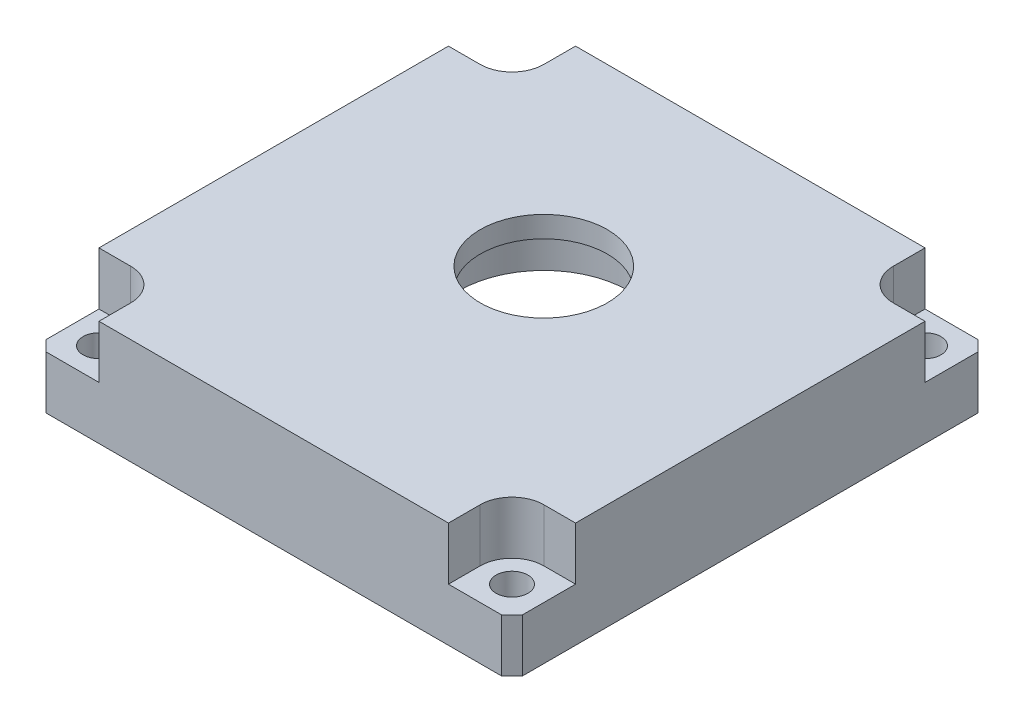
ISO-10303-21;
HEADER;
FILE_DESCRIPTION(('STEP AP214'),'2;1');
FILE_NAME('part.step','',(''),(''),'','','');
FILE_SCHEMA(('AUTOMOTIVE_DESIGN { 1 0 10303 214 1 1 1 1 }'));
ENDSEC;
DATA;
#1=APPLICATION_CONTEXT('core data for automotive mechanical design processes');
#2=APPLICATION_PROTOCOL_DEFINITION('international standard','automotive_design',2000,#1);
#3=PRODUCT_CONTEXT('',#1,'mechanical');
#4=PRODUCT('Part','Part','',(#3));
#5=PRODUCT_RELATED_PRODUCT_CATEGORY('part','',(#4));
#6=PRODUCT_DEFINITION_FORMATION('','',#4);
#7=PRODUCT_DEFINITION_CONTEXT('part definition',#1,'design');
#8=PRODUCT_DEFINITION('design','',#6,#7);
#9=PRODUCT_DEFINITION_SHAPE('','',#8);
#10=(LENGTH_UNIT() NAMED_UNIT(*) SI_UNIT(.MILLI.,.METRE.));
#11=(NAMED_UNIT(*) PLANE_ANGLE_UNIT() SI_UNIT($,.RADIAN.));
#12=(NAMED_UNIT(*) SI_UNIT($,.STERADIAN.) SOLID_ANGLE_UNIT());
#13=UNCERTAINTY_MEASURE_WITH_UNIT(LENGTH_MEASURE(1.E-05),#10,'distance_accuracy_value','');
#14=(GEOMETRIC_REPRESENTATION_CONTEXT(3) GLOBAL_UNCERTAINTY_ASSIGNED_CONTEXT((#13)) GLOBAL_UNIT_ASSIGNED_CONTEXT((#10,
#11,#12)) REPRESENTATION_CONTEXT('',''));
#15=CARTESIAN_POINT('',(0.,0.,0.));
#16=DIRECTION('',(0.,0.,1.));
#17=DIRECTION('',(1.,0.,0.));
#18=AXIS2_PLACEMENT_3D('',#15,#16,#17);
#19=CARTESIAN_POINT('',(19.5,0.,-19.5));
#20=DIRECTION('',(0.,1.,0.));
#21=DIRECTION('',(0.,0.,1.));
#22=AXIS2_PLACEMENT_3D('',#19,#20,#21);
#23=CYLINDRICAL_SURFACE('',#22,1.5);
#24=CARTESIAN_POINT('',(19.5,0.,-19.5));
#25=DIRECTION('',(0.,1.,0.));
#26=DIRECTION('',(0.,0.,-1.));
#27=AXIS2_PLACEMENT_3D('',#24,#25,#26);
#28=CIRCLE('',#27,1.5);
#29=CARTESIAN_POINT('',(19.5,0.,-21.));
#30=VERTEX_POINT('',#29);
#31=EDGE_CURVE('E388',#30,#30,#28,.T.);
#32=ORIENTED_EDGE('',*,*,#31,.F.);
#33=EDGE_LOOP('',(#32));
#34=FACE_BOUND('',#33,.T.);
#35=CARTESIAN_POINT('',(19.5,5.,-19.5));
#36=DIRECTION('',(0.,1.,0.));
#37=DIRECTION('',(0.,0.,1.));
#38=AXIS2_PLACEMENT_3D('',#35,#36,#37);
#39=CIRCLE('',#38,1.5);
#40=CARTESIAN_POINT('',(19.5,5.,-18.));
#41=VERTEX_POINT('',#40);
#42=EDGE_CURVE('E457',#41,#41,#39,.F.);
#43=ORIENTED_EDGE('',*,*,#42,.F.);
#44=EDGE_LOOP('',(#43));
#45=FACE_BOUND('',#44,.T.);
#46=ADVANCED_FACE('F38',(#34,#45),#23,.F.);
#47=CARTESIAN_POINT('',(-19.5,0.,19.5));
#48=DIRECTION('',(0.,1.,0.));
#49=DIRECTION('',(0.,0.,1.));
#50=AXIS2_PLACEMENT_3D('',#47,#48,#49);
#51=CYLINDRICAL_SURFACE('',#50,1.5);
#52=CARTESIAN_POINT('',(-19.5,0.,19.5));
#53=DIRECTION('',(0.,1.,0.));
#54=DIRECTION('',(0.,0.,-1.));
#55=AXIS2_PLACEMENT_3D('',#52,#53,#54);
#56=CIRCLE('',#55,1.5);
#57=CARTESIAN_POINT('',(-19.5,0.,18.));
#58=VERTEX_POINT('',#57);
#59=EDGE_CURVE('E397',#58,#58,#56,.T.);
#60=ORIENTED_EDGE('',*,*,#59,.F.);
#61=EDGE_LOOP('',(#60));
#62=FACE_BOUND('',#61,.T.);
#63=CARTESIAN_POINT('',(-19.5,5.,19.5));
#64=DIRECTION('',(0.,1.,0.));
#65=DIRECTION('',(0.,0.,1.));
#66=AXIS2_PLACEMENT_3D('',#63,#64,#65);
#67=CIRCLE('',#66,1.5);
#68=CARTESIAN_POINT('',(-19.5,5.,21.));
#69=VERTEX_POINT('',#68);
#70=EDGE_CURVE('E377',#69,#69,#67,.F.);
#71=ORIENTED_EDGE('',*,*,#70,.F.);
#72=EDGE_LOOP('',(#71));
#73=FACE_BOUND('',#72,.T.);
#74=ADVANCED_FACE('F596',(#62,#73),#51,.F.);
#75=CARTESIAN_POINT('',(22.5,10.,22.5));
#76=DIRECTION('',(-1.,0.,0.));
#77=DIRECTION('',(0.,0.,1.));
#78=AXIS2_PLACEMENT_3D('',#75,#76,#77);
#79=PLANE('',#78);
#80=DIRECTION('',(0.,0.,-1.));
#81=VECTOR('',#80,1.);
#82=CARTESIAN_POINT('',(22.5,5.,16.5));
#83=LINE('',#82,#81);
#84=CARTESIAN_POINT('',(22.5,5.,21.5));
#85=VERTEX_POINT('',#84);
#86=CARTESIAN_POINT('',(22.5,5.,16.5));
#87=VERTEX_POINT('',#86);
#88=EDGE_CURVE('E273',#85,#87,#83,.T.);
#89=ORIENTED_EDGE('',*,*,#88,.F.);
#90=DIRECTION('',(0.,-1.,0.));
#91=VECTOR('',#90,1.);
#92=CARTESIAN_POINT('',(22.5,10.,21.5));
#93=LINE('',#92,#91);
#94=CARTESIAN_POINT('',(22.5,0.,21.5));
#95=VERTEX_POINT('',#94);
#96=EDGE_CURVE('E466',#85,#95,#93,.T.);
#97=ORIENTED_EDGE('',*,*,#96,.T.);
#98=DIRECTION('',(0.,0.,-1.));
#99=VECTOR('',#98,1.);
#100=CARTESIAN_POINT('',(22.5,0.,22.5));
#101=LINE('',#100,#99);
#102=CARTESIAN_POINT('',(22.5,0.,-21.5));
#103=VERTEX_POINT('',#102);
#104=EDGE_CURVE('E418',#95,#103,#101,.T.);
#105=ORIENTED_EDGE('',*,*,#104,.T.);
#106=DIRECTION('',(0.,1.,0.));
#107=VECTOR('',#106,1.);
#108=CARTESIAN_POINT('',(22.5,10.,-21.5));
#109=LINE('',#108,#107);
#110=CARTESIAN_POINT('',(22.5,5.,-21.5));
#111=VERTEX_POINT('',#110);
#112=EDGE_CURVE('E228',#103,#111,#109,.T.);
#113=ORIENTED_EDGE('',*,*,#112,.T.);
#114=DIRECTION('',(0.,0.,-1.));
#115=VECTOR('',#114,1.);
#116=CARTESIAN_POINT('',(22.5,5.,-16.5));
#117=LINE('',#116,#115);
#118=CARTESIAN_POINT('',(22.5,5.,-16.5));
#119=VERTEX_POINT('',#118);
#120=EDGE_CURVE('E218',#119,#111,#117,.T.);
#121=ORIENTED_EDGE('',*,*,#120,.F.);
#122=DIRECTION('',(0.,1.,0.));
#123=VECTOR('',#122,1.);
#124=CARTESIAN_POINT('',(22.5,5.,-16.5));
#125=LINE('',#124,#123);
#126=CARTESIAN_POINT('',(22.5,10.,-16.5));
#127=VERTEX_POINT('',#126);
#128=EDGE_CURVE('E201',#119,#127,#125,.T.);
#129=ORIENTED_EDGE('',*,*,#128,.T.);
#130=DIRECTION('',(0.,0.,-1.));
#131=VECTOR('',#130,1.);
#132=CARTESIAN_POINT('',(22.5,10.,22.5));
#133=LINE('',#132,#131);
#134=CARTESIAN_POINT('',(22.5,10.,16.5));
#135=VERTEX_POINT('',#134);
#136=EDGE_CURVE('E422',#135,#127,#133,.T.);
#137=ORIENTED_EDGE('',*,*,#136,.F.);
#138=DIRECTION('',(0.,1.,0.));
#139=VECTOR('',#138,1.);
#140=CARTESIAN_POINT('',(22.5,5.,16.5));
#141=LINE('',#140,#139);
#142=EDGE_CURVE('E293',#87,#135,#141,.T.);
#143=ORIENTED_EDGE('',*,*,#142,.F.);
#144=EDGE_LOOP('',(#89,#97,#105,#113,#121,#129,#137,#143));
#145=FACE_BOUND('',#144,.T.);
#146=ADVANCED_FACE('F225',(#145),#79,.F.);
#147=CARTESIAN_POINT('',(-22.5,10.,-22.5));
#148=DIRECTION('',(0.,0.,1.));
#149=DIRECTION('',(1.,0.,0.));
#150=AXIS2_PLACEMENT_3D('',#147,#148,#149);
#151=PLANE('',#150);
#152=DIRECTION('',(-1.,0.,0.));
#153=VECTOR('',#152,1.);
#154=CARTESIAN_POINT('',(22.5,5.,-22.5));
#155=LINE('',#154,#153);
#156=CARTESIAN_POINT('',(21.5,5.,-22.5));
#157=VERTEX_POINT('',#156);
#158=CARTESIAN_POINT('',(16.5,5.,-22.5));
#159=VERTEX_POINT('',#158);
#160=EDGE_CURVE('E230',#157,#159,#155,.T.);
#161=ORIENTED_EDGE('',*,*,#160,.F.);
#162=DIRECTION('',(0.,-1.,0.));
#163=VECTOR('',#162,1.);
#164=CARTESIAN_POINT('',(21.5,10.,-22.5));
#165=LINE('',#164,#163);
#166=CARTESIAN_POINT('',(21.5,0.,-22.5));
#167=VERTEX_POINT('',#166);
#168=EDGE_CURVE('E504',#157,#167,#165,.T.);
#169=ORIENTED_EDGE('',*,*,#168,.T.);
#170=DIRECTION('',(-1.,0.,0.));
#171=VECTOR('',#170,1.);
#172=CARTESIAN_POINT('',(-22.5,0.,-22.5));
#173=LINE('',#172,#171);
#174=CARTESIAN_POINT('',(-21.5,0.,-22.5));
#175=VERTEX_POINT('',#174);
#176=EDGE_CURVE('E440',#167,#175,#173,.T.);
#177=ORIENTED_EDGE('',*,*,#176,.T.);
#178=DIRECTION('',(0.,1.,0.));
#179=VECTOR('',#178,1.);
#180=CARTESIAN_POINT('',(-21.5,10.,-22.5));
#181=LINE('',#180,#179);
#182=CARTESIAN_POINT('',(-21.5,5.,-22.5));
#183=VERTEX_POINT('',#182);
#184=EDGE_CURVE('E54',#175,#183,#181,.T.);
#185=ORIENTED_EDGE('',*,*,#184,.T.);
#186=DIRECTION('',(-1.,0.,0.));
#187=VECTOR('',#186,1.);
#188=CARTESIAN_POINT('',(-22.5,5.,-22.5));
#189=LINE('',#188,#187);
#190=CARTESIAN_POINT('',(-16.5,5.,-22.5));
#191=VERTEX_POINT('',#190);
#192=EDGE_CURVE('E355',#191,#183,#189,.T.);
#193=ORIENTED_EDGE('',*,*,#192,.F.);
#194=DIRECTION('',(0.,1.,0.));
#195=VECTOR('',#194,1.);
#196=CARTESIAN_POINT('',(-16.5,5.,-22.5));
#197=LINE('',#196,#195);
#198=CARTESIAN_POINT('',(-16.5,10.,-22.5));
#199=VERTEX_POINT('',#198);
#200=EDGE_CURVE('E381',#191,#199,#197,.T.);
#201=ORIENTED_EDGE('',*,*,#200,.T.);
#202=DIRECTION('',(-1.,0.,0.));
#203=VECTOR('',#202,1.);
#204=CARTESIAN_POINT('',(-22.5,10.,-22.5));
#205=LINE('',#204,#203);
#206=CARTESIAN_POINT('',(16.5,10.,-22.5));
#207=VERTEX_POINT('',#206);
#208=EDGE_CURVE('E425',#207,#199,#205,.T.);
#209=ORIENTED_EDGE('',*,*,#208,.F.);
#210=DIRECTION('',(0.,1.,0.));
#211=VECTOR('',#210,1.);
#212=CARTESIAN_POINT('',(16.5,5.,-22.5));
#213=LINE('',#212,#211);
#214=EDGE_CURVE('E213',#159,#207,#213,.T.);
#215=ORIENTED_EDGE('',*,*,#214,.F.);
#216=EDGE_LOOP('',(#161,#169,#177,#185,#193,#201,#209,#215));
#217=FACE_BOUND('',#216,.T.);
#218=ADVANCED_FACE('F510',(#217),#151,.F.);
#219=CARTESIAN_POINT('',(-22.5,10.,22.5));
#220=DIRECTION('',(1.,0.,0.));
#221=DIRECTION('',(0.,0.,-1.));
#222=AXIS2_PLACEMENT_3D('',#219,#220,#221);
#223=PLANE('',#222);
#224=DIRECTION('',(0.,0.,1.));
#225=VECTOR('',#224,1.);
#226=CARTESIAN_POINT('',(-22.5,0.,22.5));
#227=LINE('',#226,#225);
#228=CARTESIAN_POINT('',(-22.5,0.,-21.5));
#229=VERTEX_POINT('',#228);
#230=CARTESIAN_POINT('',(-22.5,0.,21.5));
#231=VERTEX_POINT('',#230);
#232=EDGE_CURVE('E443',#229,#231,#227,.T.);
#233=ORIENTED_EDGE('',*,*,#232,.T.);
#234=DIRECTION('',(0.,1.,0.));
#235=VECTOR('',#234,1.);
#236=CARTESIAN_POINT('',(-22.5,10.,21.5));
#237=LINE('',#236,#235);
#238=CARTESIAN_POINT('',(-22.5,5.,21.5));
#239=VERTEX_POINT('',#238);
#240=EDGE_CURVE('E496',#231,#239,#237,.T.);
#241=ORIENTED_EDGE('',*,*,#240,.T.);
#242=DIRECTION('',(0.,0.,1.));
#243=VECTOR('',#242,1.);
#244=CARTESIAN_POINT('',(-22.5,5.,16.5));
#245=LINE('',#244,#243);
#246=CARTESIAN_POINT('',(-22.5,5.,16.5));
#247=VERTEX_POINT('',#246);
#248=EDGE_CURVE('E307',#247,#239,#245,.T.);
#249=ORIENTED_EDGE('',*,*,#248,.F.);
#250=DIRECTION('',(0.,1.,0.));
#251=VECTOR('',#250,1.);
#252=CARTESIAN_POINT('',(-22.5,5.,16.5));
#253=LINE('',#252,#251);
#254=CARTESIAN_POINT('',(-22.5,10.,16.5));
#255=VERTEX_POINT('',#254);
#256=EDGE_CURVE('E323',#247,#255,#253,.T.);
#257=ORIENTED_EDGE('',*,*,#256,.T.);
#258=DIRECTION('',(0.,0.,1.));
#259=VECTOR('',#258,1.);
#260=CARTESIAN_POINT('',(-22.5,10.,22.5));
#261=LINE('',#260,#259);
#262=CARTESIAN_POINT('',(-22.5,10.,-16.5));
#263=VERTEX_POINT('',#262);
#264=EDGE_CURVE('E430',#263,#255,#261,.T.);
#265=ORIENTED_EDGE('',*,*,#264,.F.);
#266=DIRECTION('',(0.,1.,0.));
#267=VECTOR('',#266,1.);
#268=CARTESIAN_POINT('',(-22.5,5.,-16.5));
#269=LINE('',#268,#267);
#270=CARTESIAN_POINT('',(-22.5,5.,-16.5));
#271=VERTEX_POINT('',#270);
#272=EDGE_CURVE('E378',#271,#263,#269,.T.);
#273=ORIENTED_EDGE('',*,*,#272,.F.);
#274=DIRECTION('',(0.,0.,1.));
#275=VECTOR('',#274,1.);
#276=CARTESIAN_POINT('',(-22.5,5.,-16.5));
#277=LINE('',#276,#275);
#278=CARTESIAN_POINT('',(-22.5,5.,-21.5));
#279=VERTEX_POINT('',#278);
#280=EDGE_CURVE('E358',#279,#271,#277,.T.);
#281=ORIENTED_EDGE('',*,*,#280,.F.);
#282=DIRECTION('',(0.,-1.,0.));
#283=VECTOR('',#282,1.);
#284=CARTESIAN_POINT('',(-22.5,10.,-21.5));
#285=LINE('',#284,#283);
#286=EDGE_CURVE('E492',#279,#229,#285,.T.);
#287=ORIENTED_EDGE('',*,*,#286,.T.);
#288=EDGE_LOOP('',(#233,#241,#249,#257,#265,#273,#281,#287));
#289=FACE_BOUND('',#288,.T.);
#290=ADVANCED_FACE('F522',(#289),#223,.F.);
#291=CARTESIAN_POINT('',(-22.5,10.,22.5));
#292=DIRECTION('',(0.,0.,-1.));
#293=DIRECTION('',(-1.,0.,0.));
#294=AXIS2_PLACEMENT_3D('',#291,#292,#293);
#295=PLANE('',#294);
#296=DIRECTION('',(1.,0.,0.));
#297=VECTOR('',#296,1.);
#298=CARTESIAN_POINT('',(-22.5,0.,22.5));
#299=LINE('',#298,#297);
#300=CARTESIAN_POINT('',(-21.5,0.,22.5));
#301=VERTEX_POINT('',#300);
#302=CARTESIAN_POINT('',(21.5,0.,22.5));
#303=VERTEX_POINT('',#302);
#304=EDGE_CURVE('E426',#301,#303,#299,.T.);
#305=ORIENTED_EDGE('',*,*,#304,.T.);
#306=DIRECTION('',(0.,1.,0.));
#307=VECTOR('',#306,1.);
#308=CARTESIAN_POINT('',(21.5,10.,22.5));
#309=LINE('',#308,#307);
#310=CARTESIAN_POINT('',(21.5,5.,22.5));
#311=VERTEX_POINT('',#310);
#312=EDGE_CURVE('E486',#303,#311,#309,.T.);
#313=ORIENTED_EDGE('',*,*,#312,.T.);
#314=DIRECTION('',(1.,0.,0.));
#315=VECTOR('',#314,1.);
#316=CARTESIAN_POINT('',(22.5,5.,22.5));
#317=LINE('',#316,#315);
#318=CARTESIAN_POINT('',(16.5,5.,22.5));
#319=VERTEX_POINT('',#318);
#320=EDGE_CURVE('E269',#319,#311,#317,.T.);
#321=ORIENTED_EDGE('',*,*,#320,.F.);
#322=DIRECTION('',(0.,1.,0.));
#323=VECTOR('',#322,1.);
#324=CARTESIAN_POINT('',(16.5,5.,22.5));
#325=LINE('',#324,#323);
#326=CARTESIAN_POINT('',(16.5,10.,22.5));
#327=VERTEX_POINT('',#326);
#328=EDGE_CURVE('E296',#319,#327,#325,.T.);
#329=ORIENTED_EDGE('',*,*,#328,.T.);
#330=DIRECTION('',(1.,0.,0.));
#331=VECTOR('',#330,1.);
#332=CARTESIAN_POINT('',(-22.5,10.,22.5));
#333=LINE('',#332,#331);
#334=CARTESIAN_POINT('',(-16.5,10.,22.5));
#335=VERTEX_POINT('',#334);
#336=EDGE_CURVE('E434',#335,#327,#333,.T.);
#337=ORIENTED_EDGE('',*,*,#336,.F.);
#338=DIRECTION('',(0.,1.,0.));
#339=VECTOR('',#338,1.);
#340=CARTESIAN_POINT('',(-16.5,5.,22.5));
#341=LINE('',#340,#339);
#342=CARTESIAN_POINT('',(-16.5,5.,22.5));
#343=VERTEX_POINT('',#342);
#344=EDGE_CURVE('E340',#343,#335,#341,.T.);
#345=ORIENTED_EDGE('',*,*,#344,.F.);
#346=DIRECTION('',(1.,0.,0.));
#347=VECTOR('',#346,1.);
#348=CARTESIAN_POINT('',(-22.5,5.,22.5));
#349=LINE('',#348,#347);
#350=CARTESIAN_POINT('',(-21.5,5.,22.5));
#351=VERTEX_POINT('',#350);
#352=EDGE_CURVE('E312',#351,#343,#349,.T.);
#353=ORIENTED_EDGE('',*,*,#352,.F.);
#354=DIRECTION('',(0.,-1.,0.));
#355=VECTOR('',#354,1.);
#356=CARTESIAN_POINT('',(-21.5,10.,22.5));
#357=LINE('',#356,#355);
#358=EDGE_CURVE('E482',#351,#301,#357,.T.);
#359=ORIENTED_EDGE('',*,*,#358,.T.);
#360=EDGE_LOOP('',(#305,#313,#321,#329,#337,#345,#353,#359));
#361=FACE_BOUND('',#360,.T.);
#362=ADVANCED_FACE('F568',(#361),#295,.F.);
#363=CARTESIAN_POINT('',(0.,10.,0.));
#364=DIRECTION('',(0.,-1.,0.));
#365=DIRECTION('',(0.,0.,-1.));
#366=AXIS2_PLACEMENT_3D('',#363,#364,#365);
#367=PLANE('',#366);
#368=CARTESIAN_POINT('',(0.,10.,-3.));
#369=DIRECTION('',(0.,-1.,0.));
#370=DIRECTION('',(0.,0.,-1.));
#371=AXIS2_PLACEMENT_3D('',#368,#369,#370);
#372=CIRCLE('',#371,6.);
#373=CARTESIAN_POINT('',(0.,10.,-9.));
#374=VERTEX_POINT('',#373);
#375=EDGE_CURVE('E328',#374,#374,#372,.T.);
#376=ORIENTED_EDGE('',*,*,#375,.T.);
#377=EDGE_LOOP('',(#376));
#378=FACE_BOUND('',#377,.T.);
#379=ORIENTED_EDGE('',*,*,#264,.T.);
#380=DIRECTION('',(-1.,0.,0.));
#381=VECTOR('',#380,1.);
#382=CARTESIAN_POINT('',(-19.5,10.,16.5));
#383=LINE('',#382,#381);
#384=CARTESIAN_POINT('',(-19.5,10.,16.5));
#385=VERTEX_POINT('',#384);
#386=EDGE_CURVE('E324',#385,#255,#383,.T.);
#387=ORIENTED_EDGE('',*,*,#386,.F.);
#388=CARTESIAN_POINT('',(-19.5,10.,19.5));
#389=DIRECTION('',(0.,1.,0.));
#390=DIRECTION('',(0.,0.,1.));
#391=AXIS2_PLACEMENT_3D('',#388,#389,#390);
#392=CIRCLE('',#391,3.);
#393=CARTESIAN_POINT('',(-16.5,10.,19.5));
#394=VERTEX_POINT('',#393);
#395=EDGE_CURVE('E308',#394,#385,#392,.T.);
#396=ORIENTED_EDGE('',*,*,#395,.F.);
#397=DIRECTION('',(0.,0.,-1.));
#398=VECTOR('',#397,1.);
#399=CARTESIAN_POINT('',(-16.5,10.,22.5));
#400=LINE('',#399,#398);
#401=EDGE_CURVE('E327',#335,#394,#400,.T.);
#402=ORIENTED_EDGE('',*,*,#401,.F.);
#403=ORIENTED_EDGE('',*,*,#336,.T.);
#404=DIRECTION('',(0.,0.,1.));
#405=VECTOR('',#404,1.);
#406=CARTESIAN_POINT('',(16.5,10.,22.5));
#407=LINE('',#406,#405);
#408=CARTESIAN_POINT('',(16.5,10.,19.5));
#409=VERTEX_POINT('',#408);
#410=EDGE_CURVE('E284',#409,#327,#407,.T.);
#411=ORIENTED_EDGE('',*,*,#410,.F.);
#412=CARTESIAN_POINT('',(19.5,10.,19.5));
#413=DIRECTION('',(0.,1.,0.));
#414=DIRECTION('',(0.,0.,-1.));
#415=AXIS2_PLACEMENT_3D('',#412,#413,#414);
#416=CIRCLE('',#415,3.);
#417=CARTESIAN_POINT('',(19.5,10.,16.5));
#418=VERTEX_POINT('',#417);
#419=EDGE_CURVE('E281',#418,#409,#416,.T.);
#420=ORIENTED_EDGE('',*,*,#419,.F.);
#421=DIRECTION('',(-1.,0.,0.));
#422=VECTOR('',#421,1.);
#423=CARTESIAN_POINT('',(19.5,10.,16.5));
#424=LINE('',#423,#422);
#425=EDGE_CURVE('E265',#135,#418,#424,.T.);
#426=ORIENTED_EDGE('',*,*,#425,.F.);
#427=ORIENTED_EDGE('',*,*,#136,.T.);
#428=DIRECTION('',(1.,0.,0.));
#429=VECTOR('',#428,1.);
#430=CARTESIAN_POINT('',(19.5,10.,-16.5));
#431=LINE('',#430,#429);
#432=CARTESIAN_POINT('',(19.5,10.,-16.5));
#433=VERTEX_POINT('',#432);
#434=EDGE_CURVE('E207',#433,#127,#431,.T.);
#435=ORIENTED_EDGE('',*,*,#434,.F.);
#436=CARTESIAN_POINT('',(19.5,10.,-19.5));
#437=DIRECTION('',(0.,1.,0.));
#438=DIRECTION('',(0.,0.,1.));
#439=AXIS2_PLACEMENT_3D('',#436,#437,#438);
#440=CIRCLE('',#439,3.);
#441=CARTESIAN_POINT('',(16.5,10.,-19.5));
#442=VERTEX_POINT('',#441);
#443=EDGE_CURVE('E222',#442,#433,#440,.T.);
#444=ORIENTED_EDGE('',*,*,#443,.F.);
#445=DIRECTION('',(0.,0.,1.));
#446=VECTOR('',#445,1.);
#447=CARTESIAN_POINT('',(16.5,10.,-22.5));
#448=LINE('',#447,#446);
#449=EDGE_CURVE('E243',#207,#442,#448,.T.);
#450=ORIENTED_EDGE('',*,*,#449,.F.);
#451=ORIENTED_EDGE('',*,*,#208,.T.);
#452=DIRECTION('',(0.,0.,-1.));
#453=VECTOR('',#452,1.);
#454=CARTESIAN_POINT('',(-16.5,10.,-22.5));
#455=LINE('',#454,#453);
#456=CARTESIAN_POINT('',(-16.5,10.,-19.5));
#457=VERTEX_POINT('',#456);
#458=EDGE_CURVE('E368',#457,#199,#455,.T.);
#459=ORIENTED_EDGE('',*,*,#458,.F.);
#460=CARTESIAN_POINT('',(-19.5,10.,-19.5));
#461=DIRECTION('',(0.,1.,0.));
#462=DIRECTION('',(0.,0.,-1.));
#463=AXIS2_PLACEMENT_3D('',#460,#461,#462);
#464=CIRCLE('',#463,3.);
#465=CARTESIAN_POINT('',(-19.5,10.,-16.5));
#466=VERTEX_POINT('',#465);
#467=EDGE_CURVE('E254',#466,#457,#464,.T.);
#468=ORIENTED_EDGE('',*,*,#467,.F.);
#469=DIRECTION('',(1.,0.,0.));
#470=VECTOR('',#469,1.);
#471=CARTESIAN_POINT('',(-19.5,10.,-16.5));
#472=LINE('',#471,#470);
#473=EDGE_CURVE('E351',#263,#466,#472,.T.);
#474=ORIENTED_EDGE('',*,*,#473,.F.);
#475=EDGE_LOOP('',(#379,#387,#396,#402,#403,#411,#420,#426,#427,#435,#444,#450,#451,#459,#468,#474));
#476=FACE_BOUND('',#475,.T.);
#477=ADVANCED_FACE('F543',(#378,#476),#367,.F.);
#478=CARTESIAN_POINT('',(0.,0.,0.));
#479=DIRECTION('',(0.,-1.,0.));
#480=DIRECTION('',(0.,0.,-1.));
#481=AXIS2_PLACEMENT_3D('',#478,#479,#480);
#482=PLANE('',#481);
#483=ORIENTED_EDGE('',*,*,#59,.T.);
#484=EDGE_LOOP('',(#483));
#485=FACE_BOUND('',#484,.T.);
#486=CARTESIAN_POINT('',(19.5,0.,19.5));
#487=DIRECTION('',(0.,1.,0.));
#488=DIRECTION('',(0.,0.,1.));
#489=AXIS2_PLACEMENT_3D('',#486,#487,#488);
#490=CIRCLE('',#489,1.5);
#491=CARTESIAN_POINT('',(19.5,0.,21.));
#492=VERTEX_POINT('',#491);
#493=EDGE_CURVE('E393',#492,#492,#490,.T.);
#494=ORIENTED_EDGE('',*,*,#493,.T.);
#495=EDGE_LOOP('',(#494));
#496=FACE_BOUND('',#495,.T.);
#497=ORIENTED_EDGE('',*,*,#31,.T.);
#498=EDGE_LOOP('',(#497));
#499=FACE_BOUND('',#498,.T.);
#500=CARTESIAN_POINT('',(-19.5,0.,-19.5));
#501=DIRECTION('',(0.,1.,0.));
#502=DIRECTION('',(0.,0.,1.));
#503=AXIS2_PLACEMENT_3D('',#500,#501,#502);
#504=CIRCLE('',#503,1.5);
#505=CARTESIAN_POINT('',(-19.5,0.,-18.));
#506=VERTEX_POINT('',#505);
#507=EDGE_CURVE('E392',#506,#506,#504,.T.);
#508=ORIENTED_EDGE('',*,*,#507,.T.);
#509=EDGE_LOOP('',(#508));
#510=FACE_BOUND('',#509,.T.);
#511=CARTESIAN_POINT('',(0.,0.,-3.));
#512=DIRECTION('',(0.,-1.,0.));
#513=DIRECTION('',(0.,0.,-1.));
#514=AXIS2_PLACEMENT_3D('',#511,#512,#513);
#515=CIRCLE('',#514,15.);
#516=CARTESIAN_POINT('',(0.,0.,-18.));
#517=VERTEX_POINT('',#516);
#518=EDGE_CURVE('E410',#517,#517,#515,.T.);
#519=ORIENTED_EDGE('',*,*,#518,.F.);
#520=EDGE_LOOP('',(#519));
#521=FACE_BOUND('',#520,.T.);
#522=ORIENTED_EDGE('',*,*,#104,.F.);
#523=DIRECTION('',(0.707106781186548,0.,-0.707106781186548));
#524=VECTOR('',#523,1.);
#525=CARTESIAN_POINT('',(22.,0.,22.));
#526=LINE('',#525,#524);
#527=EDGE_CURVE('E479',#95,#303,#526,.F.);
#528=ORIENTED_EDGE('',*,*,#527,.T.);
#529=ORIENTED_EDGE('',*,*,#304,.F.);
#530=DIRECTION('',(0.707106781186545,0.,0.70710678118655));
#531=VECTOR('',#530,1.);
#532=CARTESIAN_POINT('',(-22.0000000000001,0.,21.9999999999999));
#533=LINE('',#532,#531);
#534=EDGE_CURVE('E476',#301,#231,#533,.F.);
#535=ORIENTED_EDGE('',*,*,#534,.T.);
#536=ORIENTED_EDGE('',*,*,#232,.F.);
#537=DIRECTION('',(-0.707106781186548,0.,0.707106781186548));
#538=VECTOR('',#537,1.);
#539=CARTESIAN_POINT('',(-22.,0.,-22.));
#540=LINE('',#539,#538);
#541=EDGE_CURVE('E470',#229,#175,#540,.F.);
#542=ORIENTED_EDGE('',*,*,#541,.T.);
#543=ORIENTED_EDGE('',*,*,#176,.F.);
#544=DIRECTION('',(-0.707106781186545,0.,-0.70710678118655));
#545=VECTOR('',#544,1.);
#546=CARTESIAN_POINT('',(22.0000000000001,0.,-21.9999999999999));
#547=LINE('',#546,#545);
#548=EDGE_CURVE('E473',#167,#103,#547,.F.);
#549=ORIENTED_EDGE('',*,*,#548,.T.);
#550=EDGE_LOOP('',(#522,#528,#529,#535,#536,#542,#543,#549));
#551=FACE_BOUND('',#550,.T.);
#552=ADVANCED_FACE('F515',(#485,#496,#499,#510,#521,#551),#482,.T.);
#553=CARTESIAN_POINT('',(0.,4.,-3.));
#554=DIRECTION('',(0.,-1.,0.));
#555=DIRECTION('',(0.,0.,-1.));
#556=AXIS2_PLACEMENT_3D('',#553,#554,#555);
#557=CYLINDRICAL_SURFACE('',#556,15.);
#558=CARTESIAN_POINT('',(0.,4.,-3.));
#559=DIRECTION('',(0.,-1.,0.));
#560=DIRECTION('',(0.,0.,-1.));
#561=AXIS2_PLACEMENT_3D('',#558,#559,#560);
#562=CIRCLE('',#561,15.);
#563=CARTESIAN_POINT('',(0.,4.,-18.));
#564=VERTEX_POINT('',#563);
#565=EDGE_CURVE('E414',#564,#564,#562,.T.);
#566=ORIENTED_EDGE('',*,*,#565,.F.);
#567=EDGE_LOOP('',(#566));
#568=FACE_BOUND('',#567,.T.);
#569=ORIENTED_EDGE('',*,*,#518,.T.);
#570=EDGE_LOOP('',(#569));
#571=FACE_BOUND('',#570,.T.);
#572=ADVANCED_FACE('F627',(#568,#571),#557,.F.);
#573=CARTESIAN_POINT('',(0.,4.,-3.));
#574=DIRECTION('',(0.,-1.,0.));
#575=DIRECTION('',(0.,0.,-1.));
#576=AXIS2_PLACEMENT_3D('',#573,#574,#575);
#577=PLANE('',#576);
#578=CARTESIAN_POINT('',(0.,4.,-3.));
#579=DIRECTION('',(0.,-1.,0.));
#580=DIRECTION('',(0.,0.,-1.));
#581=AXIS2_PLACEMENT_3D('',#578,#579,#580);
#582=CIRCLE('',#581,8.);
#583=CARTESIAN_POINT('',(0.,4.,-11.));
#584=VERTEX_POINT('',#583);
#585=EDGE_CURVE('E405',#584,#584,#582,.T.);
#586=ORIENTED_EDGE('',*,*,#585,.F.);
#587=EDGE_LOOP('',(#586));
#588=FACE_BOUND('',#587,.T.);
#589=ORIENTED_EDGE('',*,*,#565,.T.);
#590=EDGE_LOOP('',(#589));
#591=FACE_BOUND('',#590,.T.);
#592=ADVANCED_FACE('F623',(#588,#591),#577,.T.);
#593=CARTESIAN_POINT('',(0.,8.,-3.));
#594=DIRECTION('',(0.,-1.,0.));
#595=DIRECTION('',(0.,0.,-1.));
#596=AXIS2_PLACEMENT_3D('',#593,#594,#595);
#597=CYLINDRICAL_SURFACE('',#596,8.);
#598=CARTESIAN_POINT('',(0.,8.,-3.));
#599=DIRECTION('',(0.,-1.,0.));
#600=DIRECTION('',(0.,0.,-1.));
#601=AXIS2_PLACEMENT_3D('',#598,#599,#600);
#602=CIRCLE('',#601,8.);
#603=CARTESIAN_POINT('',(0.,8.,-11.));
#604=VERTEX_POINT('',#603);
#605=EDGE_CURVE('E406',#604,#604,#602,.T.);
#606=ORIENTED_EDGE('',*,*,#605,.F.);
#607=EDGE_LOOP('',(#606));
#608=FACE_BOUND('',#607,.T.);
#609=ORIENTED_EDGE('',*,*,#585,.T.);
#610=EDGE_LOOP('',(#609));
#611=FACE_BOUND('',#610,.T.);
#612=ADVANCED_FACE('F619',(#608,#611),#597,.F.);
#613=CARTESIAN_POINT('',(0.,8.,-3.));
#614=DIRECTION('',(0.,-1.,0.));
#615=DIRECTION('',(0.,0.,-1.));
#616=AXIS2_PLACEMENT_3D('',#613,#614,#615);
#617=PLANE('',#616);
#618=CARTESIAN_POINT('',(0.,8.,-3.));
#619=DIRECTION('',(0.,-1.,0.));
#620=DIRECTION('',(0.,0.,-1.));
#621=AXIS2_PLACEMENT_3D('',#618,#619,#620);
#622=CIRCLE('',#621,6.);
#623=CARTESIAN_POINT('',(0.,8.,-9.));
#624=VERTEX_POINT('',#623);
#625=EDGE_CURVE('E904',#624,#624,#622,.T.);
#626=ORIENTED_EDGE('',*,*,#625,.F.);
#627=EDGE_LOOP('',(#626));
#628=FACE_BOUND('',#627,.T.);
#629=ORIENTED_EDGE('',*,*,#605,.T.);
#630=EDGE_LOOP('',(#629));
#631=FACE_BOUND('',#630,.T.);
#632=ADVANCED_FACE('F615',(#628,#631),#617,.T.);
#633=CARTESIAN_POINT('',(-19.5,0.,-19.5));
#634=DIRECTION('',(0.,1.,0.));
#635=DIRECTION('',(0.,0.,1.));
#636=AXIS2_PLACEMENT_3D('',#633,#634,#635);
#637=CYLINDRICAL_SURFACE('',#636,1.5);
#638=CARTESIAN_POINT('',(-19.5,5.,-19.5));
#639=DIRECTION('',(0.,-1.,0.));
#640=DIRECTION('',(0.,0.,-1.));
#641=AXIS2_PLACEMENT_3D('',#638,#639,#640);
#642=CIRCLE('',#641,1.5);
#643=CARTESIAN_POINT('',(-19.5,5.,-21.));
#644=VERTEX_POINT('',#643);
#645=EDGE_CURVE('E401',#644,#644,#642,.F.);
#646=ORIENTED_EDGE('',*,*,#645,.T.);
#647=EDGE_LOOP('',(#646));
#648=FACE_BOUND('',#647,.T.);
#649=ORIENTED_EDGE('',*,*,#507,.F.);
#650=EDGE_LOOP('',(#649));
#651=FACE_BOUND('',#650,.T.);
#652=ADVANCED_FACE('F610',(#648,#651),#637,.F.);
#653=CARTESIAN_POINT('',(19.5,0.,19.5));
#654=DIRECTION('',(0.,1.,0.));
#655=DIRECTION('',(0.,0.,1.));
#656=AXIS2_PLACEMENT_3D('',#653,#654,#655);
#657=CYLINDRICAL_SURFACE('',#656,1.5);
#658=CARTESIAN_POINT('',(19.5,5.,19.5));
#659=DIRECTION('',(0.,-1.,0.));
#660=DIRECTION('',(0.,0.,-1.));
#661=AXIS2_PLACEMENT_3D('',#658,#659,#660);
#662=CIRCLE('',#661,1.5);
#663=CARTESIAN_POINT('',(19.5,5.,18.));
#664=VERTEX_POINT('',#663);
#665=EDGE_CURVE('E453',#664,#664,#662,.F.);
#666=ORIENTED_EDGE('',*,*,#665,.T.);
#667=EDGE_LOOP('',(#666));
#668=FACE_BOUND('',#667,.T.);
#669=ORIENTED_EDGE('',*,*,#493,.F.);
#670=EDGE_LOOP('',(#669));
#671=FACE_BOUND('',#670,.T.);
#672=ADVANCED_FACE('F608',(#668,#671),#657,.F.);
#673=CARTESIAN_POINT('',(-19.5,5.,19.5));
#674=DIRECTION('',(0.,1.,0.));
#675=DIRECTION('',(0.,0.,1.));
#676=AXIS2_PLACEMENT_3D('',#673,#674,#675);
#677=PLANE('',#676);
#678=ORIENTED_EDGE('',*,*,#248,.T.);
#679=DIRECTION('',(-0.707106781186545,0.,-0.70710678118655));
#680=VECTOR('',#679,1.);
#681=CARTESIAN_POINT('',(-22.,5.,22.));
#682=LINE('',#681,#680);
#683=EDGE_CURVE('E499',#239,#351,#682,.F.);
#684=ORIENTED_EDGE('',*,*,#683,.T.);
#685=ORIENTED_EDGE('',*,*,#352,.T.);
#686=DIRECTION('',(0.,0.,-1.));
#687=VECTOR('',#686,1.);
#688=CARTESIAN_POINT('',(-16.5,5.,22.5));
#689=LINE('',#688,#687);
#690=CARTESIAN_POINT('',(-16.5,5.,19.5));
#691=VERTEX_POINT('',#690);
#692=EDGE_CURVE('E315',#343,#691,#689,.T.);
#693=ORIENTED_EDGE('',*,*,#692,.T.);
#694=CARTESIAN_POINT('',(-19.5,5.,19.5));
#695=DIRECTION('',(0.,1.,0.));
#696=DIRECTION('',(0.,0.,1.));
#697=AXIS2_PLACEMENT_3D('',#694,#695,#696);
#698=CIRCLE('',#697,3.);
#699=CARTESIAN_POINT('',(-19.5,5.,16.5));
#700=VERTEX_POINT('',#699);
#701=EDGE_CURVE('E319',#691,#700,#698,.T.);
#702=ORIENTED_EDGE('',*,*,#701,.T.);
#703=DIRECTION('',(-1.,0.,0.));
#704=VECTOR('',#703,1.);
#705=CARTESIAN_POINT('',(-19.5,5.,16.5));
#706=LINE('',#705,#704);
#707=EDGE_CURVE('E303',#700,#247,#706,.T.);
#708=ORIENTED_EDGE('',*,*,#707,.T.);
#709=EDGE_LOOP('',(#678,#684,#685,#693,#702,#708));
#710=FACE_BOUND('',#709,.T.);
#711=ORIENTED_EDGE('',*,*,#70,.T.);
#712=EDGE_LOOP('',(#711));
#713=FACE_BOUND('',#712,.T.);
#714=ADVANCED_FACE('F577',(#710,#713),#677,.T.);
#715=CARTESIAN_POINT('',(-19.5,5.,16.5));
#716=DIRECTION('',(0.,0.,-1.));
#717=DIRECTION('',(-1.,0.,0.));
#718=AXIS2_PLACEMENT_3D('',#715,#716,#717);
#719=PLANE('',#718);
#720=ORIENTED_EDGE('',*,*,#386,.T.);
#721=ORIENTED_EDGE('',*,*,#256,.F.);
#722=ORIENTED_EDGE('',*,*,#707,.F.);
#723=DIRECTION('',(0.,1.,0.));
#724=VECTOR('',#723,1.);
#725=CARTESIAN_POINT('',(-19.5,5.,16.5));
#726=LINE('',#725,#724);
#727=EDGE_CURVE('E285',#700,#385,#726,.T.);
#728=ORIENTED_EDGE('',*,*,#727,.T.);
#729=EDGE_LOOP('',(#720,#721,#722,#728));
#730=FACE_BOUND('',#729,.T.);
#731=ADVANCED_FACE('F582',(#730),#719,.F.);
#732=CARTESIAN_POINT('',(-19.5,5.,19.5));
#733=DIRECTION('',(0.,1.,0.));
#734=DIRECTION('',(0.,0.,1.));
#735=AXIS2_PLACEMENT_3D('',#732,#733,#734);
#736=CYLINDRICAL_SURFACE('',#735,3.);
#737=ORIENTED_EDGE('',*,*,#395,.T.);
#738=ORIENTED_EDGE('',*,*,#727,.F.);
#739=ORIENTED_EDGE('',*,*,#701,.F.);
#740=DIRECTION('',(0.,1.,0.));
#741=VECTOR('',#740,1.);
#742=CARTESIAN_POINT('',(-16.5,5.,19.5));
#743=LINE('',#742,#741);
#744=EDGE_CURVE('E337',#691,#394,#743,.T.);
#745=ORIENTED_EDGE('',*,*,#744,.T.);
#746=EDGE_LOOP('',(#737,#738,#739,#745));
#747=FACE_BOUND('',#746,.T.);
#748=ADVANCED_FACE('F686',(#747),#736,.F.);
#749=CARTESIAN_POINT('',(-16.5,5.,22.5));
#750=DIRECTION('',(1.,0.,0.));
#751=DIRECTION('',(0.,0.,-1.));
#752=AXIS2_PLACEMENT_3D('',#749,#750,#751);
#753=PLANE('',#752);
#754=ORIENTED_EDGE('',*,*,#401,.T.);
#755=ORIENTED_EDGE('',*,*,#744,.F.);
#756=ORIENTED_EDGE('',*,*,#692,.F.);
#757=ORIENTED_EDGE('',*,*,#344,.T.);
#758=EDGE_LOOP('',(#754,#755,#756,#757));
#759=FACE_BOUND('',#758,.T.);
#760=ADVANCED_FACE('F675',(#759),#753,.F.);
#761=CARTESIAN_POINT('',(19.5,5.,19.5));
#762=DIRECTION('',(0.,-1.,0.));
#763=DIRECTION('',(0.,0.,-1.));
#764=AXIS2_PLACEMENT_3D('',#761,#762,#763);
#765=PLANE('',#764);
#766=ORIENTED_EDGE('',*,*,#320,.T.);
#767=DIRECTION('',(-0.707106781186548,0.,0.707106781186548));
#768=VECTOR('',#767,1.);
#769=CARTESIAN_POINT('',(22.5,5.,21.5));
#770=LINE('',#769,#768);
#771=EDGE_CURVE('E489',#311,#85,#770,.F.);
#772=ORIENTED_EDGE('',*,*,#771,.T.);
#773=ORIENTED_EDGE('',*,*,#88,.T.);
#774=DIRECTION('',(-1.,0.,0.));
#775=VECTOR('',#774,1.);
#776=CARTESIAN_POINT('',(19.5,5.,16.5));
#777=LINE('',#776,#775);
#778=CARTESIAN_POINT('',(19.5,5.,16.5));
#779=VERTEX_POINT('',#778);
#780=EDGE_CURVE('E276',#87,#779,#777,.T.);
#781=ORIENTED_EDGE('',*,*,#780,.T.);
#782=CARTESIAN_POINT('',(19.5,5.,19.5));
#783=DIRECTION('',(0.,1.,0.));
#784=DIRECTION('',(0.,0.,-1.));
#785=AXIS2_PLACEMENT_3D('',#782,#783,#784);
#786=CIRCLE('',#785,3.);
#787=CARTESIAN_POINT('',(16.5,5.,19.5));
#788=VERTEX_POINT('',#787);
#789=EDGE_CURVE('E260',#779,#788,#786,.T.);
#790=ORIENTED_EDGE('',*,*,#789,.T.);
#791=DIRECTION('',(0.,0.,1.));
#792=VECTOR('',#791,1.);
#793=CARTESIAN_POINT('',(16.5,5.,22.5));
#794=LINE('',#793,#792);
#795=EDGE_CURVE('E264',#788,#319,#794,.T.);
#796=ORIENTED_EDGE('',*,*,#795,.T.);
#797=EDGE_LOOP('',(#766,#772,#773,#781,#790,#796));
#798=FACE_BOUND('',#797,.T.);
#799=ORIENTED_EDGE('',*,*,#665,.F.);
#800=EDGE_LOOP('',(#799));
#801=FACE_BOUND('',#800,.T.);
#802=ADVANCED_FACE('F559',(#798,#801),#765,.F.);
#803=CARTESIAN_POINT('',(19.5,5.,19.5));
#804=DIRECTION('',(0.,1.,0.));
#805=DIRECTION('',(0.,0.,1.));
#806=AXIS2_PLACEMENT_3D('',#803,#804,#805);
#807=CYLINDRICAL_SURFACE('',#806,3.);
#808=ORIENTED_EDGE('',*,*,#419,.T.);
#809=DIRECTION('',(0.,1.,0.));
#810=VECTOR('',#809,1.);
#811=CARTESIAN_POINT('',(16.5,5.,19.5));
#812=LINE('',#811,#810);
#813=EDGE_CURVE('E280',#788,#409,#812,.T.);
#814=ORIENTED_EDGE('',*,*,#813,.F.);
#815=ORIENTED_EDGE('',*,*,#789,.F.);
#816=DIRECTION('',(0.,1.,0.));
#817=VECTOR('',#816,1.);
#818=CARTESIAN_POINT('',(19.5,5.,16.5));
#819=LINE('',#818,#817);
#820=EDGE_CURVE('E244',#779,#418,#819,.T.);
#821=ORIENTED_EDGE('',*,*,#820,.T.);
#822=EDGE_LOOP('',(#808,#814,#815,#821));
#823=FACE_BOUND('',#822,.T.);
#824=ADVANCED_FACE('F674',(#823),#807,.F.);
#825=CARTESIAN_POINT('',(19.5,5.,16.5));
#826=DIRECTION('',(0.,0.,-1.));
#827=DIRECTION('',(-1.,0.,0.));
#828=AXIS2_PLACEMENT_3D('',#825,#826,#827);
#829=PLANE('',#828);
#830=ORIENTED_EDGE('',*,*,#425,.T.);
#831=ORIENTED_EDGE('',*,*,#820,.F.);
#832=ORIENTED_EDGE('',*,*,#780,.F.);
#833=ORIENTED_EDGE('',*,*,#142,.T.);
#834=EDGE_LOOP('',(#830,#831,#832,#833));
#835=FACE_BOUND('',#834,.T.);
#836=ADVANCED_FACE('F556',(#835),#829,.F.);
#837=CARTESIAN_POINT('',(16.5,5.,22.5));
#838=DIRECTION('',(-1.,0.,0.));
#839=DIRECTION('',(0.,0.,1.));
#840=AXIS2_PLACEMENT_3D('',#837,#838,#839);
#841=PLANE('',#840);
#842=ORIENTED_EDGE('',*,*,#410,.T.);
#843=ORIENTED_EDGE('',*,*,#328,.F.);
#844=ORIENTED_EDGE('',*,*,#795,.F.);
#845=ORIENTED_EDGE('',*,*,#813,.T.);
#846=EDGE_LOOP('',(#842,#843,#844,#845));
#847=FACE_BOUND('',#846,.T.);
#848=ADVANCED_FACE('F665',(#847),#841,.F.);
#849=CARTESIAN_POINT('',(19.5,5.,-19.5));
#850=DIRECTION('',(0.,1.,0.));
#851=DIRECTION('',(0.,0.,1.));
#852=AXIS2_PLACEMENT_3D('',#849,#850,#851);
#853=PLANE('',#852);
#854=ORIENTED_EDGE('',*,*,#120,.T.);
#855=DIRECTION('',(0.707106781186545,0.,0.70710678118655));
#856=VECTOR('',#855,1.);
#857=CARTESIAN_POINT('',(22.,5.,-22.));
#858=LINE('',#857,#856);
#859=EDGE_CURVE('E47',#111,#157,#858,.F.);
#860=ORIENTED_EDGE('',*,*,#859,.T.);
#861=ORIENTED_EDGE('',*,*,#160,.T.);
#862=DIRECTION('',(0.,0.,1.));
#863=VECTOR('',#862,1.);
#864=CARTESIAN_POINT('',(16.5,5.,-22.5));
#865=LINE('',#864,#863);
#866=CARTESIAN_POINT('',(16.5,5.,-19.5));
#867=VERTEX_POINT('',#866);
#868=EDGE_CURVE('E233',#159,#867,#865,.T.);
#869=ORIENTED_EDGE('',*,*,#868,.T.);
#870=CARTESIAN_POINT('',(19.5,5.,-19.5));
#871=DIRECTION('',(0.,1.,0.));
#872=DIRECTION('',(0.,0.,1.));
#873=AXIS2_PLACEMENT_3D('',#870,#871,#872);
#874=CIRCLE('',#873,3.);
#875=CARTESIAN_POINT('',(19.5,5.,-16.5));
#876=VERTEX_POINT('',#875);
#877=EDGE_CURVE('E214',#867,#876,#874,.T.);
#878=ORIENTED_EDGE('',*,*,#877,.T.);
#879=DIRECTION('',(1.,0.,0.));
#880=VECTOR('',#879,1.);
#881=CARTESIAN_POINT('',(19.5,5.,-16.5));
#882=LINE('',#881,#880);
#883=EDGE_CURVE('E204',#876,#119,#882,.T.);
#884=ORIENTED_EDGE('',*,*,#883,.T.);
#885=EDGE_LOOP('',(#854,#860,#861,#869,#878,#884));
#886=FACE_BOUND('',#885,.T.);
#887=ORIENTED_EDGE('',*,*,#42,.T.);
#888=EDGE_LOOP('',(#887));
#889=FACE_BOUND('',#888,.T.);
#890=ADVANCED_FACE('F216',(#886,#889),#853,.T.);
#891=CARTESIAN_POINT('',(19.5,5.,-16.5));
#892=DIRECTION('',(0.,0.,1.));
#893=DIRECTION('',(1.,0.,0.));
#894=AXIS2_PLACEMENT_3D('',#891,#892,#893);
#895=PLANE('',#894);
#896=ORIENTED_EDGE('',*,*,#434,.T.);
#897=ORIENTED_EDGE('',*,*,#128,.F.);
#898=ORIENTED_EDGE('',*,*,#883,.F.);
#899=DIRECTION('',(0.,1.,0.));
#900=VECTOR('',#899,1.);
#901=CARTESIAN_POINT('',(19.5,5.,-16.5));
#902=LINE('',#901,#900);
#903=EDGE_CURVE('E251',#876,#433,#902,.T.);
#904=ORIENTED_EDGE('',*,*,#903,.T.);
#905=EDGE_LOOP('',(#896,#897,#898,#904));
#906=FACE_BOUND('',#905,.T.);
#907=ADVANCED_FACE('F203',(#906),#895,.F.);
#908=CARTESIAN_POINT('',(19.5,5.,-19.5));
#909=DIRECTION('',(0.,1.,0.));
#910=DIRECTION('',(0.,0.,1.));
#911=AXIS2_PLACEMENT_3D('',#908,#909,#910);
#912=CYLINDRICAL_SURFACE('',#911,3.);
#913=ORIENTED_EDGE('',*,*,#443,.T.);
#914=ORIENTED_EDGE('',*,*,#903,.F.);
#915=ORIENTED_EDGE('',*,*,#877,.F.);
#916=DIRECTION('',(0.,1.,0.));
#917=VECTOR('',#916,1.);
#918=CARTESIAN_POINT('',(16.5,5.,-19.5));
#919=LINE('',#918,#917);
#920=EDGE_CURVE('E255',#867,#442,#919,.T.);
#921=ORIENTED_EDGE('',*,*,#920,.T.);
#922=EDGE_LOOP('',(#913,#914,#915,#921));
#923=FACE_BOUND('',#922,.T.);
#924=ADVANCED_FACE('F549',(#923),#912,.F.);
#925=CARTESIAN_POINT('',(16.5,5.,-22.5));
#926=DIRECTION('',(-1.,0.,0.));
#927=DIRECTION('',(0.,0.,1.));
#928=AXIS2_PLACEMENT_3D('',#925,#926,#927);
#929=PLANE('',#928);
#930=ORIENTED_EDGE('',*,*,#449,.T.);
#931=ORIENTED_EDGE('',*,*,#920,.F.);
#932=ORIENTED_EDGE('',*,*,#868,.F.);
#933=ORIENTED_EDGE('',*,*,#214,.T.);
#934=EDGE_LOOP('',(#930,#931,#932,#933));
#935=FACE_BOUND('',#934,.T.);
#936=ADVANCED_FACE('F546',(#935),#929,.F.);
#937=CARTESIAN_POINT('',(-19.5,5.,-19.5));
#938=DIRECTION('',(0.,-1.,0.));
#939=DIRECTION('',(0.,0.,-1.));
#940=AXIS2_PLACEMENT_3D('',#937,#938,#939);
#941=PLANE('',#940);
#942=ORIENTED_EDGE('',*,*,#192,.T.);
#943=DIRECTION('',(0.707106781186548,0.,-0.707106781186548));
#944=VECTOR('',#943,1.);
#945=CARTESIAN_POINT('',(-22.5,5.,-21.5));
#946=LINE('',#945,#944);
#947=EDGE_CURVE('E11',#183,#279,#946,.F.);
#948=ORIENTED_EDGE('',*,*,#947,.T.);
#949=ORIENTED_EDGE('',*,*,#280,.T.);
#950=DIRECTION('',(1.,0.,0.));
#951=VECTOR('',#950,1.);
#952=CARTESIAN_POINT('',(-19.5,5.,-16.5));
#953=LINE('',#952,#951);
#954=CARTESIAN_POINT('',(-19.5,5.,-16.5));
#955=VERTEX_POINT('',#954);
#956=EDGE_CURVE('E361',#271,#955,#953,.T.);
#957=ORIENTED_EDGE('',*,*,#956,.T.);
#958=CARTESIAN_POINT('',(-19.5,5.,-19.5));
#959=DIRECTION('',(0.,1.,0.));
#960=DIRECTION('',(0.,0.,-1.));
#961=AXIS2_PLACEMENT_3D('',#958,#959,#960);
#962=CIRCLE('',#961,3.);
#963=CARTESIAN_POINT('',(-16.5,5.,-19.5));
#964=VERTEX_POINT('',#963);
#965=EDGE_CURVE('E346',#955,#964,#962,.T.);
#966=ORIENTED_EDGE('',*,*,#965,.T.);
#967=DIRECTION('',(0.,0.,-1.));
#968=VECTOR('',#967,1.);
#969=CARTESIAN_POINT('',(-16.5,5.,-22.5));
#970=LINE('',#969,#968);
#971=EDGE_CURVE('E350',#964,#191,#970,.T.);
#972=ORIENTED_EDGE('',*,*,#971,.T.);
#973=EDGE_LOOP('',(#942,#948,#949,#957,#966,#972));
#974=FACE_BOUND('',#973,.T.);
#975=ORIENTED_EDGE('',*,*,#645,.F.);
#976=EDGE_LOOP('',(#975));
#977=FACE_BOUND('',#976,.T.);
#978=ADVANCED_FACE('F528',(#974,#977),#941,.F.);
#979=CARTESIAN_POINT('',(-19.5,5.,-19.5));
#980=DIRECTION('',(0.,1.,0.));
#981=DIRECTION('',(0.,0.,1.));
#982=AXIS2_PLACEMENT_3D('',#979,#980,#981);
#983=CYLINDRICAL_SURFACE('',#982,3.);
#984=ORIENTED_EDGE('',*,*,#467,.T.);
#985=DIRECTION('',(0.,1.,0.));
#986=VECTOR('',#985,1.);
#987=CARTESIAN_POINT('',(-16.5,5.,-19.5));
#988=LINE('',#987,#986);
#989=EDGE_CURVE('E365',#964,#457,#988,.T.);
#990=ORIENTED_EDGE('',*,*,#989,.F.);
#991=ORIENTED_EDGE('',*,*,#965,.F.);
#992=DIRECTION('',(0.,1.,0.));
#993=VECTOR('',#992,1.);
#994=CARTESIAN_POINT('',(-19.5,5.,-16.5));
#995=LINE('',#994,#993);
#996=EDGE_CURVE('E374',#955,#466,#995,.T.);
#997=ORIENTED_EDGE('',*,*,#996,.T.);
#998=EDGE_LOOP('',(#984,#990,#991,#997));
#999=FACE_BOUND('',#998,.T.);
#1000=ADVANCED_FACE('F536',(#999),#983,.F.);
#1001=CARTESIAN_POINT('',(-19.5,5.,-16.5));
#1002=DIRECTION('',(0.,0.,1.));
#1003=DIRECTION('',(1.,0.,0.));
#1004=AXIS2_PLACEMENT_3D('',#1001,#1002,#1003);
#1005=PLANE('',#1004);
#1006=ORIENTED_EDGE('',*,*,#473,.T.);
#1007=ORIENTED_EDGE('',*,*,#996,.F.);
#1008=ORIENTED_EDGE('',*,*,#956,.F.);
#1009=ORIENTED_EDGE('',*,*,#272,.T.);
#1010=EDGE_LOOP('',(#1006,#1007,#1008,#1009));
#1011=FACE_BOUND('',#1010,.T.);
#1012=ADVANCED_FACE('F531',(#1011),#1005,.F.);
#1013=CARTESIAN_POINT('',(-16.5,5.,-22.5));
#1014=DIRECTION('',(1.,0.,0.));
#1015=DIRECTION('',(0.,0.,-1.));
#1016=AXIS2_PLACEMENT_3D('',#1013,#1014,#1015);
#1017=PLANE('',#1016);
#1018=ORIENTED_EDGE('',*,*,#458,.T.);
#1019=ORIENTED_EDGE('',*,*,#200,.F.);
#1020=ORIENTED_EDGE('',*,*,#971,.F.);
#1021=ORIENTED_EDGE('',*,*,#989,.T.);
#1022=EDGE_LOOP('',(#1018,#1019,#1020,#1021));
#1023=FACE_BOUND('',#1022,.T.);
#1024=ADVANCED_FACE('F585',(#1023),#1017,.F.);
#1025=CARTESIAN_POINT('',(22.5,10.,21.5));
#1026=DIRECTION('',(-0.707106781186547,0.,-0.707106781186547));
#1027=DIRECTION('',(0.,-1.,0.));
#1028=AXIS2_PLACEMENT_3D('',#1025,#1026,#1027);
#1029=PLANE('',#1028);
#1030=ORIENTED_EDGE('',*,*,#771,.F.);
#1031=ORIENTED_EDGE('',*,*,#312,.F.);
#1032=ORIENTED_EDGE('',*,*,#527,.F.);
#1033=ORIENTED_EDGE('',*,*,#96,.F.);
#1034=EDGE_LOOP('',(#1030,#1031,#1032,#1033));
#1035=FACE_BOUND('',#1034,.T.);
#1036=ADVANCED_FACE('F565',(#1035),#1029,.F.);
#1037=CARTESIAN_POINT('',(-21.5,10.,22.5));
#1038=DIRECTION('',(0.70710678118655,0.,-0.707106781186545));
#1039=DIRECTION('',(0.,-1.,0.));
#1040=AXIS2_PLACEMENT_3D('',#1037,#1038,#1039);
#1041=PLANE('',#1040);
#1042=ORIENTED_EDGE('',*,*,#683,.F.);
#1043=ORIENTED_EDGE('',*,*,#240,.F.);
#1044=ORIENTED_EDGE('',*,*,#534,.F.);
#1045=ORIENTED_EDGE('',*,*,#358,.F.);
#1046=EDGE_LOOP('',(#1042,#1043,#1044,#1045));
#1047=FACE_BOUND('',#1046,.T.);
#1048=ADVANCED_FACE('F574',(#1047),#1041,.F.);
#1049=CARTESIAN_POINT('',(21.5,10.,-22.5));
#1050=DIRECTION('',(-0.70710678118655,0.,0.707106781186545));
#1051=DIRECTION('',(0.,-1.,0.));
#1052=AXIS2_PLACEMENT_3D('',#1049,#1050,#1051);
#1053=PLANE('',#1052);
#1054=ORIENTED_EDGE('',*,*,#859,.F.);
#1055=ORIENTED_EDGE('',*,*,#112,.F.);
#1056=ORIENTED_EDGE('',*,*,#548,.F.);
#1057=ORIENTED_EDGE('',*,*,#168,.F.);
#1058=EDGE_LOOP('',(#1054,#1055,#1056,#1057));
#1059=FACE_BOUND('',#1058,.T.);
#1060=ADVANCED_FACE('F647',(#1059),#1053,.F.);
#1061=CARTESIAN_POINT('',(-22.5,10.,-21.5));
#1062=DIRECTION('',(0.707106781186547,0.,0.707106781186547));
#1063=DIRECTION('',(0.,-1.,0.));
#1064=AXIS2_PLACEMENT_3D('',#1061,#1062,#1063);
#1065=PLANE('',#1064);
#1066=ORIENTED_EDGE('',*,*,#947,.F.);
#1067=ORIENTED_EDGE('',*,*,#184,.F.);
#1068=ORIENTED_EDGE('',*,*,#541,.F.);
#1069=ORIENTED_EDGE('',*,*,#286,.F.);
#1070=EDGE_LOOP('',(#1066,#1067,#1068,#1069));
#1071=FACE_BOUND('',#1070,.T.);
#1072=ADVANCED_FACE('F40',(#1071),#1065,.F.);
#1073=CARTESIAN_POINT('',(0.,10.,-3.));
#1074=DIRECTION('',(0.,-1.,0.));
#1075=DIRECTION('',(0.,0.,-1.));
#1076=AXIS2_PLACEMENT_3D('',#1073,#1074,#1075);
#1077=CYLINDRICAL_SURFACE('',#1076,6.);
#1078=ORIENTED_EDGE('',*,*,#375,.F.);
#1079=EDGE_LOOP('',(#1078));
#1080=FACE_BOUND('',#1079,.T.);
#1081=ORIENTED_EDGE('',*,*,#625,.T.);
#1082=EDGE_LOOP('',(#1081));
#1083=FACE_BOUND('',#1082,.T.);
#1084=ADVANCED_FACE('F652',(#1080,#1083),#1077,.F.);
#1085=CLOSED_SHELL('',(#46,#74,#146,#218,#290,#362,#477,#552,#572,#592,#612,#632,#652,#672,#714,
#731,#748,#760,#802,#824,#836,#848,#890,#907,#924,#936,#978,#1000,#1012,#1024,#1036,#1048,#1060,
#1072,#1084));
#1086=MANIFOLD_SOLID_BREP('B2',#1085);
#1087=ADVANCED_BREP_SHAPE_REPRESENTATION('',(#18,#1086),#14);
#1088=SHAPE_DEFINITION_REPRESENTATION(#9,#1087);
ENDSEC;
END-ISO-10303-21;
